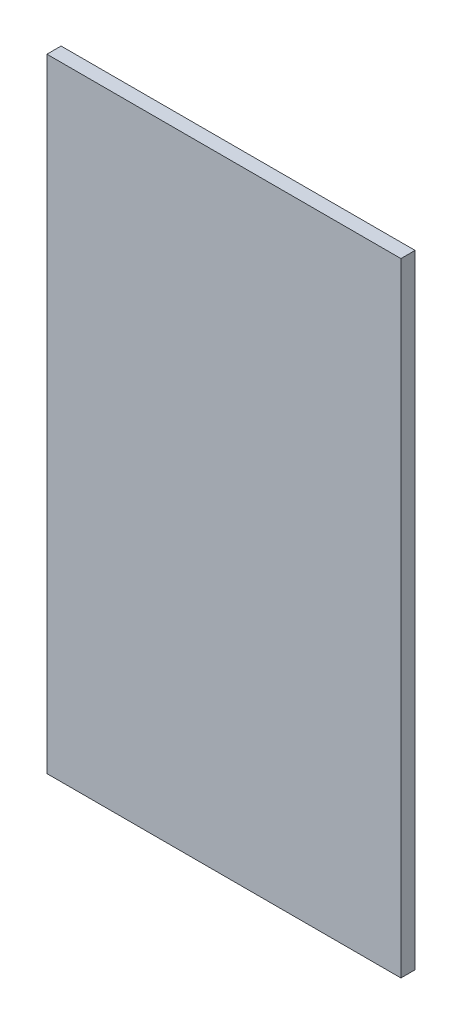
ISO-10303-21;
HEADER;
FILE_DESCRIPTION(('STEP AP214'),'2;1');
FILE_NAME('part.step','',(''),(''),'','','');
FILE_SCHEMA(('AUTOMOTIVE_DESIGN { 1 0 10303 214 1 1 1 1 }'));
ENDSEC;
DATA;
#1=APPLICATION_CONTEXT('core data for automotive mechanical design processes');
#2=APPLICATION_PROTOCOL_DEFINITION('international standard','automotive_design',2000,#1);
#3=PRODUCT_CONTEXT('',#1,'mechanical');
#4=PRODUCT('Part','Part','',(#3));
#5=PRODUCT_RELATED_PRODUCT_CATEGORY('part','',(#4));
#6=PRODUCT_DEFINITION_FORMATION('','',#4);
#7=PRODUCT_DEFINITION_CONTEXT('part definition',#1,'design');
#8=PRODUCT_DEFINITION('design','',#6,#7);
#9=PRODUCT_DEFINITION_SHAPE('','',#8);
#10=(LENGTH_UNIT() NAMED_UNIT(*) SI_UNIT(.MILLI.,.METRE.));
#11=(NAMED_UNIT(*) PLANE_ANGLE_UNIT() SI_UNIT($,.RADIAN.));
#12=(NAMED_UNIT(*) SI_UNIT($,.STERADIAN.) SOLID_ANGLE_UNIT());
#13=UNCERTAINTY_MEASURE_WITH_UNIT(LENGTH_MEASURE(1.E-05),#10,'distance_accuracy_value','');
#14=(GEOMETRIC_REPRESENTATION_CONTEXT(3) GLOBAL_UNCERTAINTY_ASSIGNED_CONTEXT((#13)) GLOBAL_UNIT_ASSIGNED_CONTEXT((#10,
#11,#12)) REPRESENTATION_CONTEXT('',''));
#15=CARTESIAN_POINT('',(0.,0.,0.));
#16=DIRECTION('',(0.,0.,1.));
#17=DIRECTION('',(1.,0.,0.));
#18=AXIS2_PLACEMENT_3D('',#15,#16,#17);
#19=CARTESIAN_POINT('',(-28.5714285714286,241.104761904762,6.));
#20=DIRECTION('',(1.,0.,0.));
#21=DIRECTION('',(0.,1.,0.));
#22=AXIS2_PLACEMENT_3D('',#19,#20,#21);
#23=PLANE('',#22);
#24=DIRECTION('',(0.,-1.,0.));
#25=VECTOR('',#24,1.);
#26=CARTESIAN_POINT('',(-28.5714285714286,241.104761904762,0.));
#27=LINE('',#26,#25);
#28=CARTESIAN_POINT('',(-28.5714285714286,241.104761904762,0.));
#29=VERTEX_POINT('',#28);
#30=CARTESIAN_POINT('',(-28.5714285714286,-22.8952380952381,0.));
#31=VERTEX_POINT('',#30);
#32=EDGE_CURVE('E96',#29,#31,#27,.T.);
#33=ORIENTED_EDGE('',*,*,#32,.T.);
#34=DIRECTION('',(0.,0.,-1.));
#35=VECTOR('',#34,1.);
#36=CARTESIAN_POINT('',(-28.5714285714286,-22.8952380952381,6.));
#37=LINE('',#36,#35);
#38=CARTESIAN_POINT('',(-28.5714285714286,-22.8952380952381,6.));
#39=VERTEX_POINT('',#38);
#40=EDGE_CURVE('E11',#39,#31,#37,.T.);
#41=ORIENTED_EDGE('',*,*,#40,.F.);
#42=DIRECTION('',(0.,-1.,0.));
#43=VECTOR('',#42,1.);
#44=CARTESIAN_POINT('',(-28.5714285714286,241.104761904762,6.));
#45=LINE('',#44,#43);
#46=CARTESIAN_POINT('',(-28.5714285714286,241.104761904762,6.));
#47=VERTEX_POINT('',#46);
#48=EDGE_CURVE('E84',#47,#39,#45,.T.);
#49=ORIENTED_EDGE('',*,*,#48,.F.);
#50=DIRECTION('',(0.,0.,-1.));
#51=VECTOR('',#50,1.);
#52=CARTESIAN_POINT('',(-28.5714285714286,241.104761904762,6.));
#53=LINE('',#52,#51);
#54=EDGE_CURVE('E92',#47,#29,#53,.T.);
#55=ORIENTED_EDGE('',*,*,#54,.T.);
#56=EDGE_LOOP('',(#33,#41,#49,#55));
#57=FACE_BOUND('',#56,.T.);
#58=ADVANCED_FACE('F33',(#57),#23,.F.);
#59=CARTESIAN_POINT('',(-28.5714285714286,-22.8952380952381,6.));
#60=DIRECTION('',(0.,1.,0.));
#61=DIRECTION('',(0.,0.,1.));
#62=AXIS2_PLACEMENT_3D('',#59,#60,#61);
#63=PLANE('',#62);
#64=DIRECTION('',(1.,0.,0.));
#65=VECTOR('',#64,1.);
#66=CARTESIAN_POINT('',(-28.5714285714286,-22.8952380952381,0.));
#67=LINE('',#66,#65);
#68=CARTESIAN_POINT('',(121.428571428571,-22.8952380952381,0.));
#69=VERTEX_POINT('',#68);
#70=EDGE_CURVE('E88',#31,#69,#67,.T.);
#71=ORIENTED_EDGE('',*,*,#70,.T.);
#72=DIRECTION('',(0.,0.,-1.));
#73=VECTOR('',#72,1.);
#74=CARTESIAN_POINT('',(121.428571428571,-22.8952380952381,6.));
#75=LINE('',#74,#73);
#76=CARTESIAN_POINT('',(121.428571428571,-22.8952380952381,6.));
#77=VERTEX_POINT('',#76);
#78=EDGE_CURVE('E41',#77,#69,#75,.T.);
#79=ORIENTED_EDGE('',*,*,#78,.F.);
#80=DIRECTION('',(1.,0.,0.));
#81=VECTOR('',#80,1.);
#82=CARTESIAN_POINT('',(-28.5714285714286,-22.8952380952381,6.));
#83=LINE('',#82,#81);
#84=EDGE_CURVE('E79',#39,#77,#83,.T.);
#85=ORIENTED_EDGE('',*,*,#84,.F.);
#86=ORIENTED_EDGE('',*,*,#40,.T.);
#87=EDGE_LOOP('',(#71,#79,#85,#86));
#88=FACE_BOUND('',#87,.T.);
#89=ADVANCED_FACE('F87',(#88),#63,.F.);
#90=CARTESIAN_POINT('',(121.428571428571,241.104761904762,6.));
#91=DIRECTION('',(-1.,0.,0.));
#92=DIRECTION('',(0.,-1.,0.));
#93=AXIS2_PLACEMENT_3D('',#90,#91,#92);
#94=PLANE('',#93);
#95=DIRECTION('',(0.,1.,0.));
#96=VECTOR('',#95,1.);
#97=CARTESIAN_POINT('',(121.428571428571,241.104761904762,0.));
#98=LINE('',#97,#96);
#99=CARTESIAN_POINT('',(121.428571428571,241.104761904762,0.));
#100=VERTEX_POINT('',#99);
#101=EDGE_CURVE('E66',#69,#100,#98,.T.);
#102=ORIENTED_EDGE('',*,*,#101,.T.);
#103=DIRECTION('',(0.,0.,-1.));
#104=VECTOR('',#103,1.);
#105=CARTESIAN_POINT('',(121.428571428571,241.104761904762,6.));
#106=LINE('',#105,#104);
#107=CARTESIAN_POINT('',(121.428571428571,241.104761904762,6.));
#108=VERTEX_POINT('',#107);
#109=EDGE_CURVE('E89',#108,#100,#106,.T.);
#110=ORIENTED_EDGE('',*,*,#109,.F.);
#111=DIRECTION('',(0.,1.,0.));
#112=VECTOR('',#111,1.);
#113=CARTESIAN_POINT('',(121.428571428571,241.104761904762,6.));
#114=LINE('',#113,#112);
#115=EDGE_CURVE('E82',#77,#108,#114,.T.);
#116=ORIENTED_EDGE('',*,*,#115,.F.);
#117=ORIENTED_EDGE('',*,*,#78,.T.);
#118=EDGE_LOOP('',(#102,#110,#116,#117));
#119=FACE_BOUND('',#118,.T.);
#120=ADVANCED_FACE('F90',(#119),#94,.F.);
#121=CARTESIAN_POINT('',(-28.5714285714286,241.104761904762,6.));
#122=DIRECTION('',(0.,-1.,0.));
#123=DIRECTION('',(0.,0.,-1.));
#124=AXIS2_PLACEMENT_3D('',#121,#122,#123);
#125=PLANE('',#124);
#126=DIRECTION('',(-1.,0.,0.));
#127=VECTOR('',#126,1.);
#128=CARTESIAN_POINT('',(-28.5714285714286,241.104761904762,0.));
#129=LINE('',#128,#127);
#130=EDGE_CURVE('E72',#100,#29,#129,.T.);
#131=ORIENTED_EDGE('',*,*,#130,.T.);
#132=ORIENTED_EDGE('',*,*,#54,.F.);
#133=DIRECTION('',(-1.,0.,0.));
#134=VECTOR('',#133,1.);
#135=CARTESIAN_POINT('',(-28.5714285714286,241.104761904762,6.));
#136=LINE('',#135,#134);
#137=EDGE_CURVE('E49',#108,#47,#136,.T.);
#138=ORIENTED_EDGE('',*,*,#137,.F.);
#139=ORIENTED_EDGE('',*,*,#109,.T.);
#140=EDGE_LOOP('',(#131,#132,#138,#139));
#141=FACE_BOUND('',#140,.T.);
#142=ADVANCED_FACE('F103',(#141),#125,.F.);
#143=CARTESIAN_POINT('',(0.,0.,6.));
#144=DIRECTION('',(0.,0.,1.));
#145=DIRECTION('',(1.,0.,0.));
#146=AXIS2_PLACEMENT_3D('',#143,#144,#145);
#147=PLANE('',#146);
#148=ORIENTED_EDGE('',*,*,#48,.T.);
#149=ORIENTED_EDGE('',*,*,#84,.T.);
#150=ORIENTED_EDGE('',*,*,#115,.T.);
#151=ORIENTED_EDGE('',*,*,#137,.T.);
#152=EDGE_LOOP('',(#148,#149,#150,#151));
#153=FACE_BOUND('',#152,.T.);
#154=ADVANCED_FACE('F80',(#153),#147,.T.);
#155=CARTESIAN_POINT('',(0.,0.,0.));
#156=DIRECTION('',(0.,0.,1.));
#157=DIRECTION('',(1.,0.,0.));
#158=AXIS2_PLACEMENT_3D('',#155,#156,#157);
#159=PLANE('',#158);
#160=ORIENTED_EDGE('',*,*,#32,.F.);
#161=ORIENTED_EDGE('',*,*,#130,.F.);
#162=ORIENTED_EDGE('',*,*,#101,.F.);
#163=ORIENTED_EDGE('',*,*,#70,.F.);
#164=EDGE_LOOP('',(#160,#161,#162,#163));
#165=FACE_BOUND('',#164,.T.);
#166=ADVANCED_FACE('F106',(#165),#159,.F.);
#167=CLOSED_SHELL('',(#58,#89,#120,#142,#154,#166));
#168=MANIFOLD_SOLID_BREP('B2',#167);
#169=ADVANCED_BREP_SHAPE_REPRESENTATION('',(#18,#168),#14);
#170=SHAPE_DEFINITION_REPRESENTATION(#9,#169);
ENDSEC;
END-ISO-10303-21;
